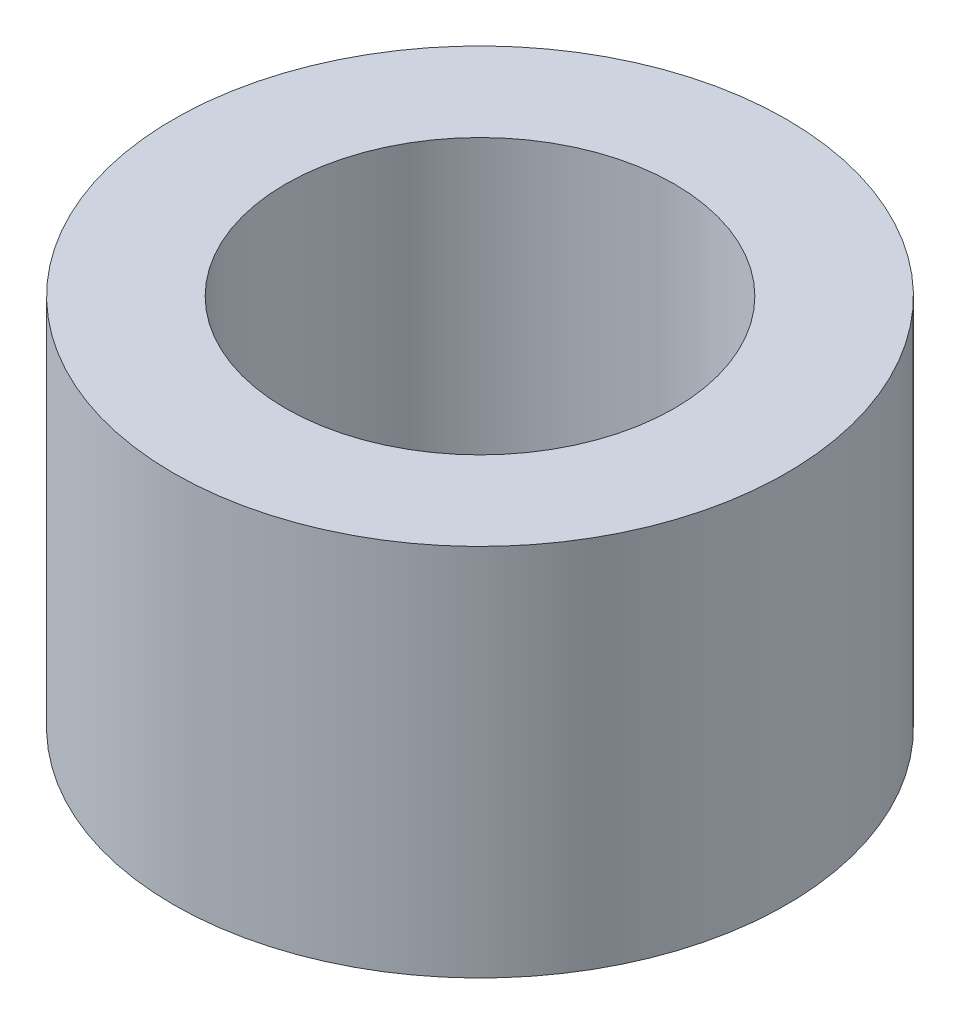
ISO-10303-21;
HEADER;
FILE_DESCRIPTION(('STEP AP214'),'2;1');
FILE_NAME('part.step','',(''),(''),'','','');
FILE_SCHEMA(('AUTOMOTIVE_DESIGN { 1 0 10303 214 1 1 1 1 }'));
ENDSEC;
DATA;
#1=APPLICATION_CONTEXT('core data for automotive mechanical design processes');
#2=APPLICATION_PROTOCOL_DEFINITION('international standard','automotive_design',2000,#1);
#3=PRODUCT_CONTEXT('',#1,'mechanical');
#4=PRODUCT('Part','Part','',(#3));
#5=PRODUCT_RELATED_PRODUCT_CATEGORY('part','',(#4));
#6=PRODUCT_DEFINITION_FORMATION('','',#4);
#7=PRODUCT_DEFINITION_CONTEXT('part definition',#1,'design');
#8=PRODUCT_DEFINITION('design','',#6,#7);
#9=PRODUCT_DEFINITION_SHAPE('','',#8);
#10=(LENGTH_UNIT() NAMED_UNIT(*) SI_UNIT(.MILLI.,.METRE.));
#11=(NAMED_UNIT(*) PLANE_ANGLE_UNIT() SI_UNIT($,.RADIAN.));
#12=(NAMED_UNIT(*) SI_UNIT($,.STERADIAN.) SOLID_ANGLE_UNIT());
#13=UNCERTAINTY_MEASURE_WITH_UNIT(LENGTH_MEASURE(1.E-05),#10,'distance_accuracy_value','');
#14=(GEOMETRIC_REPRESENTATION_CONTEXT(3) GLOBAL_UNCERTAINTY_ASSIGNED_CONTEXT((#13)) GLOBAL_UNIT_ASSIGNED_CONTEXT((#10,
#11,#12)) REPRESENTATION_CONTEXT('',''));
#15=CARTESIAN_POINT('',(0.,0.,0.));
#16=DIRECTION('',(0.,0.,1.));
#17=DIRECTION('',(1.,0.,0.));
#18=AXIS2_PLACEMENT_3D('',#15,#16,#17);
#19=CARTESIAN_POINT('',(-88.9,5.,0.));
#20=DIRECTION('',(0.,1.,0.));
#21=DIRECTION('',(0.,0.,1.));
#22=AXIS2_PLACEMENT_3D('',#19,#20,#21);
#23=PLANE('',#22);
#24=CARTESIAN_POINT('',(-88.9,5.,0.));
#25=DIRECTION('',(0.,1.,0.));
#26=DIRECTION('',(0.,0.,1.));
#27=AXIS2_PLACEMENT_3D('',#24,#25,#26);
#28=CIRCLE('',#27,8.20000000000002);
#29=CARTESIAN_POINT('',(-88.9,5.,8.20000000000005));
#30=VERTEX_POINT('',#29);
#31=EDGE_CURVE('E10',#30,#30,#28,.T.);
#32=ORIENTED_EDGE('',*,*,#31,.T.);
#33=EDGE_LOOP('',(#32));
#34=FACE_BOUND('',#33,.T.);
#35=CARTESIAN_POINT('',(-88.9,5.,0.));
#36=DIRECTION('',(0.,1.,0.));
#37=DIRECTION('',(0.,0.,1.));
#38=AXIS2_PLACEMENT_3D('',#35,#36,#37);
#39=CIRCLE('',#38,5.20000000000001);
#40=CARTESIAN_POINT('',(-88.9,5.,5.20000000000004));
#41=VERTEX_POINT('',#40);
#42=EDGE_CURVE('E50',#41,#41,#39,.T.);
#43=ORIENTED_EDGE('',*,*,#42,.F.);
#44=EDGE_LOOP('',(#43));
#45=FACE_BOUND('',#44,.T.);
#46=ADVANCED_FACE('F39',(#34,#45),#23,.T.);
#47=CARTESIAN_POINT('',(-88.9,-5.,0.));
#48=DIRECTION('',(0.,1.,0.));
#49=DIRECTION('',(0.,0.,1.));
#50=AXIS2_PLACEMENT_3D('',#47,#48,#49);
#51=PLANE('',#50);
#52=CARTESIAN_POINT('',(-88.9,-5.,0.));
#53=DIRECTION('',(0.,1.,0.));
#54=DIRECTION('',(0.,0.,1.));
#55=AXIS2_PLACEMENT_3D('',#52,#53,#54);
#56=CIRCLE('',#55,8.20000000000002);
#57=CARTESIAN_POINT('',(-88.9,-5.,8.20000000000005));
#58=VERTEX_POINT('',#57);
#59=EDGE_CURVE('E43',#58,#58,#56,.T.);
#60=ORIENTED_EDGE('',*,*,#59,.F.);
#61=EDGE_LOOP('',(#60));
#62=FACE_BOUND('',#61,.T.);
#63=CARTESIAN_POINT('',(-88.9,-5.,0.));
#64=DIRECTION('',(0.,1.,0.));
#65=DIRECTION('',(0.,0.,1.));
#66=AXIS2_PLACEMENT_3D('',#63,#64,#65);
#67=CIRCLE('',#66,5.20000000000001);
#68=CARTESIAN_POINT('',(-88.9,-5.,5.20000000000004));
#69=VERTEX_POINT('',#68);
#70=EDGE_CURVE('E52',#69,#69,#67,.T.);
#71=ORIENTED_EDGE('',*,*,#70,.T.);
#72=EDGE_LOOP('',(#71));
#73=FACE_BOUND('',#72,.T.);
#74=ADVANCED_FACE('F62',(#62,#73),#51,.F.);
#75=CARTESIAN_POINT('',(-88.9,5.,0.));
#76=DIRECTION('',(0.,-1.,0.));
#77=DIRECTION('',(0.,0.,-1.));
#78=AXIS2_PLACEMENT_3D('',#75,#76,#77);
#79=CYLINDRICAL_SURFACE('',#78,8.20000000000002);
#80=ORIENTED_EDGE('',*,*,#31,.F.);
#81=EDGE_LOOP('',(#80));
#82=FACE_BOUND('',#81,.T.);
#83=ORIENTED_EDGE('',*,*,#59,.T.);
#84=EDGE_LOOP('',(#83));
#85=FACE_BOUND('',#84,.T.);
#86=ADVANCED_FACE('F41',(#82,#85),#79,.T.);
#87=CARTESIAN_POINT('',(-88.9,5.,0.));
#88=DIRECTION('',(0.,-1.,0.));
#89=DIRECTION('',(0.,0.,-1.));
#90=AXIS2_PLACEMENT_3D('',#87,#88,#89);
#91=CYLINDRICAL_SURFACE('',#90,5.20000000000001);
#92=ORIENTED_EDGE('',*,*,#42,.T.);
#93=EDGE_LOOP('',(#92));
#94=FACE_BOUND('',#93,.T.);
#95=ORIENTED_EDGE('',*,*,#70,.F.);
#96=EDGE_LOOP('',(#95));
#97=FACE_BOUND('',#96,.T.);
#98=ADVANCED_FACE('F58',(#94,#97),#91,.F.);
#99=CLOSED_SHELL('',(#46,#74,#86,#98));
#100=MANIFOLD_SOLID_BREP('B2',#99);
#101=ADVANCED_BREP_SHAPE_REPRESENTATION('',(#18,#100),#14);
#102=SHAPE_DEFINITION_REPRESENTATION(#9,#101);
ENDSEC;
END-ISO-10303-21;
